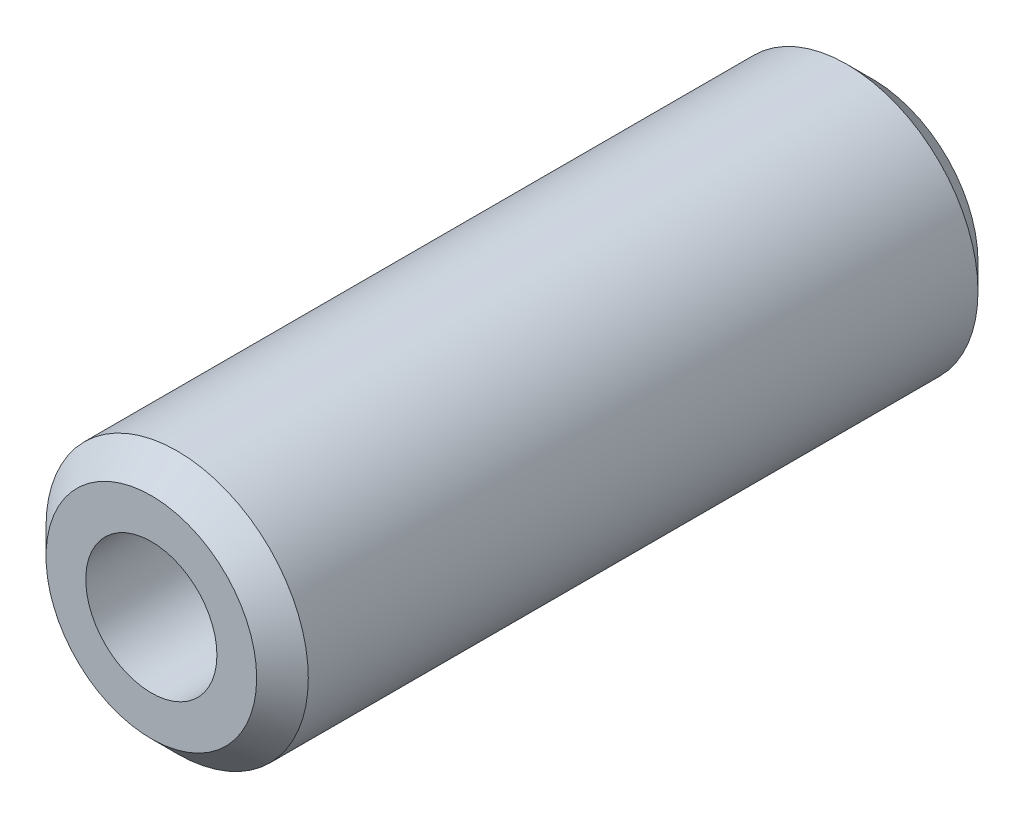
ISO-10303-21;
HEADER;
FILE_DESCRIPTION(('STEP AP214'),'2;1');
FILE_NAME('part.step','',(''),(''),'','','');
FILE_SCHEMA(('AUTOMOTIVE_DESIGN { 1 0 10303 214 1 1 1 1 }'));
ENDSEC;
DATA;
#1=APPLICATION_CONTEXT('core data for automotive mechanical design processes');
#2=APPLICATION_PROTOCOL_DEFINITION('international standard','automotive_design',2000,#1);
#3=PRODUCT_CONTEXT('',#1,'mechanical');
#4=PRODUCT('Part','Part','',(#3));
#5=PRODUCT_RELATED_PRODUCT_CATEGORY('part','',(#4));
#6=PRODUCT_DEFINITION_FORMATION('','',#4);
#7=PRODUCT_DEFINITION_CONTEXT('part definition',#1,'design');
#8=PRODUCT_DEFINITION('design','',#6,#7);
#9=PRODUCT_DEFINITION_SHAPE('','',#8);
#10=(LENGTH_UNIT() NAMED_UNIT(*) SI_UNIT(.MILLI.,.METRE.));
#11=(NAMED_UNIT(*) PLANE_ANGLE_UNIT() SI_UNIT($,.RADIAN.));
#12=(NAMED_UNIT(*) SI_UNIT($,.STERADIAN.) SOLID_ANGLE_UNIT());
#13=UNCERTAINTY_MEASURE_WITH_UNIT(LENGTH_MEASURE(1.E-05),#10,'distance_accuracy_value','');
#14=(GEOMETRIC_REPRESENTATION_CONTEXT(3) GLOBAL_UNCERTAINTY_ASSIGNED_CONTEXT((#13)) GLOBAL_UNIT_ASSIGNED_CONTEXT((#10,
#11,#12)) REPRESENTATION_CONTEXT('',''));
#15=CARTESIAN_POINT('',(0.,0.,0.));
#16=DIRECTION('',(0.,0.,1.));
#17=DIRECTION('',(1.,0.,0.));
#18=AXIS2_PLACEMENT_3D('',#15,#16,#17);
#19=CARTESIAN_POINT('',(0.,0.,69.85));
#20=DIRECTION('',(0.,0.,1.));
#21=DIRECTION('',(1.,0.,0.));
#22=AXIS2_PLACEMENT_3D('',#19,#20,#21);
#23=PLANE('',#22);
#24=CARTESIAN_POINT('',(0.,0.,69.85));
#25=DIRECTION('',(0.,0.,1.));
#26=DIRECTION('',(1.,0.,0.));
#27=AXIS2_PLACEMENT_3D('',#24,#25,#26);
#28=CIRCLE('',#27,10.2);
#29=CARTESIAN_POINT('',(10.2,0.,69.85));
#30=VERTEX_POINT('',#29);
#31=EDGE_CURVE('E50',#30,#30,#28,.T.);
#32=ORIENTED_EDGE('',*,*,#31,.T.);
#33=EDGE_LOOP('',(#32));
#34=FACE_BOUND('',#33,.T.);
#35=CARTESIAN_POINT('',(0.,0.,69.85));
#36=DIRECTION('',(0.,0.,1.));
#37=DIRECTION('',(1.,0.,0.));
#38=AXIS2_PLACEMENT_3D('',#35,#36,#37);
#39=CIRCLE('',#38,6.35);
#40=CARTESIAN_POINT('',(6.35,0.,69.85));
#41=VERTEX_POINT('',#40);
#42=EDGE_CURVE('E55',#41,#41,#39,.T.);
#43=ORIENTED_EDGE('',*,*,#42,.F.);
#44=EDGE_LOOP('',(#43));
#45=FACE_BOUND('',#44,.T.);
#46=ADVANCED_FACE('F34',(#34,#45),#23,.T.);
#47=CARTESIAN_POINT('',(0.,0.,0.));
#48=DIRECTION('',(0.,0.,1.));
#49=DIRECTION('',(1.,0.,0.));
#50=AXIS2_PLACEMENT_3D('',#47,#48,#49);
#51=PLANE('',#50);
#52=CARTESIAN_POINT('',(0.,0.,0.));
#53=DIRECTION('',(0.,0.,1.));
#54=DIRECTION('',(1.,0.,0.));
#55=AXIS2_PLACEMENT_3D('',#52,#53,#54);
#56=CIRCLE('',#55,10.2);
#57=CARTESIAN_POINT('',(10.2,0.,0.));
#58=VERTEX_POINT('',#57);
#59=EDGE_CURVE('E10',#58,#58,#56,.F.);
#60=ORIENTED_EDGE('',*,*,#59,.T.);
#61=EDGE_LOOP('',(#60));
#62=FACE_BOUND('',#61,.T.);
#63=CARTESIAN_POINT('',(0.,0.,0.));
#64=DIRECTION('',(0.,0.,1.));
#65=DIRECTION('',(1.,0.,0.));
#66=AXIS2_PLACEMENT_3D('',#63,#64,#65);
#67=CIRCLE('',#66,6.35);
#68=CARTESIAN_POINT('',(6.35,0.,0.));
#69=VERTEX_POINT('',#68);
#70=EDGE_CURVE('E56',#69,#69,#67,.T.);
#71=ORIENTED_EDGE('',*,*,#70,.T.);
#72=EDGE_LOOP('',(#71));
#73=FACE_BOUND('',#72,.T.);
#74=ADVANCED_FACE('F66',(#62,#73),#51,.F.);
#75=CARTESIAN_POINT('',(0.,0.,69.85));
#76=DIRECTION('',(0.,0.,-1.));
#77=DIRECTION('',(-1.,0.,0.));
#78=AXIS2_PLACEMENT_3D('',#75,#76,#77);
#79=CYLINDRICAL_SURFACE('',#78,12.7);
#80=CARTESIAN_POINT('',(0.,0.,2.5));
#81=DIRECTION('',(0.,0.,1.));
#82=DIRECTION('',(1.,0.,0.));
#83=AXIS2_PLACEMENT_3D('',#80,#81,#82);
#84=CIRCLE('',#83,12.7);
#85=CARTESIAN_POINT('',(12.7,0.,2.5));
#86=VERTEX_POINT('',#85);
#87=EDGE_CURVE('E42',#86,#86,#84,.T.);
#88=ORIENTED_EDGE('',*,*,#87,.T.);
#89=EDGE_LOOP('',(#88));
#90=FACE_BOUND('',#89,.T.);
#91=CARTESIAN_POINT('',(0.,0.,67.35));
#92=DIRECTION('',(0.,0.,1.));
#93=DIRECTION('',(1.,0.,0.));
#94=AXIS2_PLACEMENT_3D('',#91,#92,#93);
#95=CIRCLE('',#94,12.7);
#96=CARTESIAN_POINT('',(12.7,0.,67.35));
#97=VERTEX_POINT('',#96);
#98=EDGE_CURVE('E46',#97,#97,#95,.F.);
#99=ORIENTED_EDGE('',*,*,#98,.T.);
#100=EDGE_LOOP('',(#99));
#101=FACE_BOUND('',#100,.T.);
#102=ADVANCED_FACE('F72',(#90,#101),#79,.T.);
#103=CARTESIAN_POINT('',(0.,0.,69.85));
#104=DIRECTION('',(0.,0.,-1.));
#105=DIRECTION('',(-1.,0.,0.));
#106=AXIS2_PLACEMENT_3D('',#103,#104,#105);
#107=CYLINDRICAL_SURFACE('',#106,6.35);
#108=ORIENTED_EDGE('',*,*,#42,.T.);
#109=EDGE_LOOP('',(#108));
#110=FACE_BOUND('',#109,.T.);
#111=ORIENTED_EDGE('',*,*,#70,.F.);
#112=EDGE_LOOP('',(#111));
#113=FACE_BOUND('',#112,.T.);
#114=ADVANCED_FACE('F62',(#110,#113),#107,.F.);
#115=CARTESIAN_POINT('',(0.,0.,69.85));
#116=DIRECTION('',(0.,0.,-1.));
#117=DIRECTION('',(-1.,0.,0.));
#118=AXIS2_PLACEMENT_3D('',#115,#116,#117);
#119=CONICAL_SURFACE('',#118,10.2,0.785398163397448);
#120=ORIENTED_EDGE('',*,*,#98,.F.);
#121=EDGE_LOOP('',(#120));
#122=FACE_BOUND('',#121,.T.);
#123=ORIENTED_EDGE('',*,*,#31,.F.);
#124=EDGE_LOOP('',(#123));
#125=FACE_BOUND('',#124,.T.);
#126=ADVANCED_FACE('F78',(#122,#125),#119,.T.);
#127=CARTESIAN_POINT('',(0.,0.,2.5));
#128=DIRECTION('',(0.,0.,1.));
#129=DIRECTION('',(1.,0.,0.));
#130=AXIS2_PLACEMENT_3D('',#127,#128,#129);
#131=CONICAL_SURFACE('',#130,12.7,0.785398163397453);
#132=ORIENTED_EDGE('',*,*,#59,.F.);
#133=EDGE_LOOP('',(#132));
#134=FACE_BOUND('',#133,.T.);
#135=ORIENTED_EDGE('',*,*,#87,.F.);
#136=EDGE_LOOP('',(#135));
#137=FACE_BOUND('',#136,.T.);
#138=ADVANCED_FACE('F37',(#134,#137),#131,.T.);
#139=CLOSED_SHELL('',(#46,#74,#102,#114,#126,#138));
#140=MANIFOLD_SOLID_BREP('B2',#139);
#141=ADVANCED_BREP_SHAPE_REPRESENTATION('',(#18,#140),#14);
#142=SHAPE_DEFINITION_REPRESENTATION(#9,#141);
ENDSEC;
END-ISO-10303-21;
